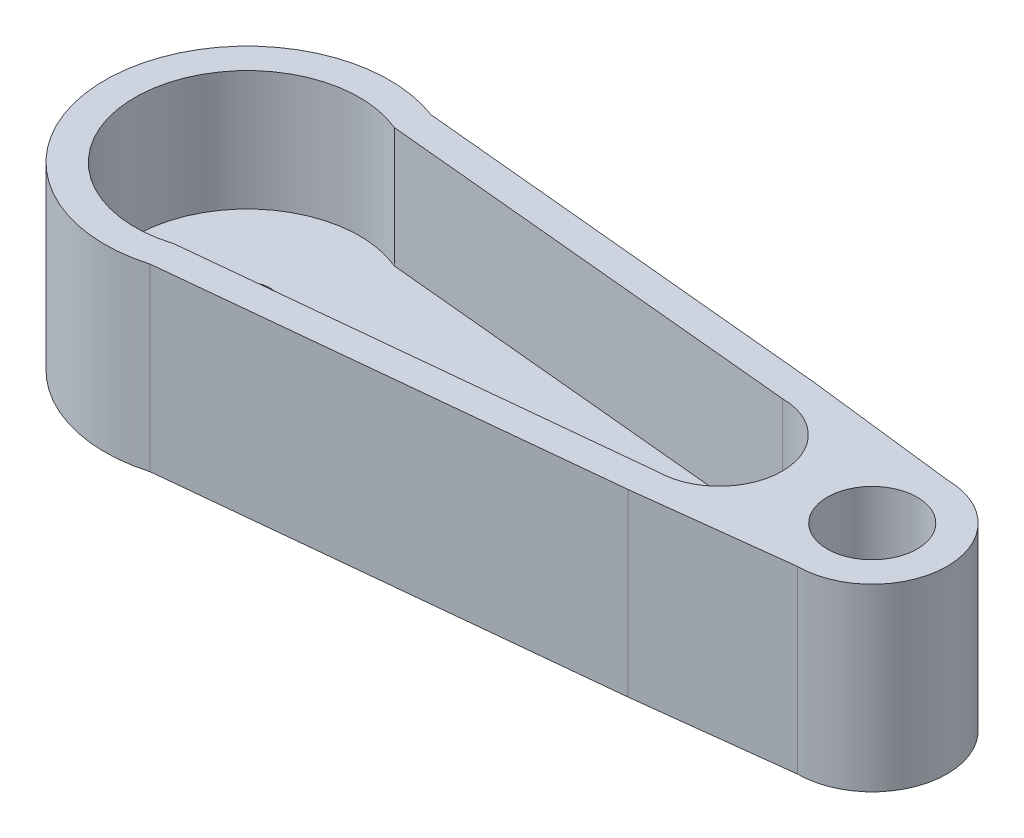
ISO-10303-21;
HEADER;
FILE_DESCRIPTION(('STEP AP214'),'2;1');
FILE_NAME('part.step','',(''),(''),'','','');
FILE_SCHEMA(('AUTOMOTIVE_DESIGN { 1 0 10303 214 1 1 1 1 }'));
ENDSEC;
DATA;
#1=APPLICATION_CONTEXT('core data for automotive mechanical design processes');
#2=APPLICATION_PROTOCOL_DEFINITION('international standard','automotive_design',2000,#1);
#3=PRODUCT_CONTEXT('',#1,'mechanical');
#4=PRODUCT('Part','Part','',(#3));
#5=PRODUCT_RELATED_PRODUCT_CATEGORY('part','',(#4));
#6=PRODUCT_DEFINITION_FORMATION('','',#4);
#7=PRODUCT_DEFINITION_CONTEXT('part definition',#1,'design');
#8=PRODUCT_DEFINITION('design','',#6,#7);
#9=PRODUCT_DEFINITION_SHAPE('','',#8);
#10=(LENGTH_UNIT() NAMED_UNIT(*) SI_UNIT(.MILLI.,.METRE.));
#11=(NAMED_UNIT(*) PLANE_ANGLE_UNIT() SI_UNIT($,.RADIAN.));
#12=(NAMED_UNIT(*) SI_UNIT($,.STERADIAN.) SOLID_ANGLE_UNIT());
#13=UNCERTAINTY_MEASURE_WITH_UNIT(LENGTH_MEASURE(1.E-05),#10,'distance_accuracy_value','');
#14=(GEOMETRIC_REPRESENTATION_CONTEXT(3) GLOBAL_UNCERTAINTY_ASSIGNED_CONTEXT((#13)) GLOBAL_UNIT_ASSIGNED_CONTEXT((#10,
#11,#12)) REPRESENTATION_CONTEXT('',''));
#15=CARTESIAN_POINT('',(0.,0.,0.));
#16=DIRECTION('',(0.,0.,1.));
#17=DIRECTION('',(1.,0.,0.));
#18=AXIS2_PLACEMENT_3D('',#15,#16,#17);
#19=CARTESIAN_POINT('',(0.,6.,0.));
#20=DIRECTION('',(0.,1.,0.));
#21=DIRECTION('',(0.,0.,1.));
#22=AXIS2_PLACEMENT_3D('',#19,#20,#21);
#23=PLANE('',#22);
#24=CARTESIAN_POINT('',(25.8499995720762,6.,-5.0016288422967));
#25=DIRECTION('',(0.,1.,0.));
#26=DIRECTION('',(0.,0.,1.));
#27=AXIS2_PLACEMENT_3D('',#24,#25,#26);
#28=CIRCLE('',#27,1.5);
#29=CARTESIAN_POINT('',(25.8499995720762,6.,-3.5016288422967));
#30=VERTEX_POINT('',#29);
#31=EDGE_CURVE('E145',#30,#30,#28,.T.);
#32=ORIENTED_EDGE('',*,*,#31,.F.);
#33=EDGE_LOOP('',(#32));
#34=FACE_BOUND('',#33,.T.);
#35=CARTESIAN_POINT('',(5.,6.,-5.));
#36=DIRECTION('',(0.,1.,0.));
#37=DIRECTION('',(0.,0.,1.));
#38=AXIS2_PLACEMENT_3D('',#35,#36,#37);
#39=CIRCLE('',#38,3.75);
#40=CARTESIAN_POINT('',(6.45010186973943,6.,-8.4582805796202));
#41=VERTEX_POINT('',#40);
#42=CARTESIAN_POINT('',(6.12769858731704,6.,-1.42357777993661));
#43=VERTEX_POINT('',#42);
#44=EDGE_CURVE('E178',#41,#43,#39,.T.);
#45=ORIENTED_EDGE('',*,*,#44,.F.);
#46=DIRECTION('',(0.995519190717505,0.,0.0945597214101386));
#47=VECTOR('',#46,1.);
#48=CARTESIAN_POINT('',(6.45010186973943,6.,-8.4582805796202));
#49=LINE('',#48,#47);
#50=CARTESIAN_POINT('',(20.75,6.,-7.1));
#51=VERTEX_POINT('',#50);
#52=EDGE_CURVE('E195',#41,#51,#49,.T.);
#53=ORIENTED_EDGE('',*,*,#52,.T.);
#54=CARTESIAN_POINT('',(20.75,6.,-5.));
#55=DIRECTION('',(0.,1.,0.));
#56=DIRECTION('',(0.,0.,1.));
#57=AXIS2_PLACEMENT_3D('',#54,#55,#56);
#58=CIRCLE('',#57,2.1);
#59=CARTESIAN_POINT('',(20.75,6.,-2.9));
#60=VERTEX_POINT('',#59);
#61=EDGE_CURVE('E212',#60,#51,#58,.T.);
#62=ORIENTED_EDGE('',*,*,#61,.F.);
#63=DIRECTION('',(0.994941120206471,0.,-0.100459779624941));
#64=VECTOR('',#63,1.);
#65=CARTESIAN_POINT('',(6.12769858731704,6.,-1.42357777993661));
#66=LINE('',#65,#64);
#67=EDGE_CURVE('E208',#43,#60,#66,.T.);
#68=ORIENTED_EDGE('',*,*,#67,.F.);
#69=EDGE_LOOP('',(#45,#53,#62,#68));
#70=FACE_BOUND('',#69,.T.);
#71=DIRECTION('',(-0.995519190717505,0.,-0.0945597214101386));
#72=VECTOR('',#71,1.);
#73=CARTESIAN_POINT('',(0.948462418420399,6.,-9.98535660988745));
#74=LINE('',#73,#72);
#75=CARTESIAN_POINT('',(20.8019731467672,6.,-8.09956429067298));
#76=VERTEX_POINT('',#75);
#77=CARTESIAN_POINT('',(6.68717667508372,6.,-9.44026292769397));
#78=VERTEX_POINT('',#77);
#79=EDGE_CURVE('E160',#76,#78,#74,.T.);
#80=ORIENTED_EDGE('',*,*,#79,.T.);
#81=CARTESIAN_POINT('',(5.,6.,-5.));
#82=DIRECTION('',(0.,1.,0.));
#83=DIRECTION('',(0.,0.,1.));
#84=AXIS2_PLACEMENT_3D('',#81,#82,#83);
#85=CIRCLE('',#84,4.75);
#86=CARTESIAN_POINT('',(6.32431463911399,6.,-0.438345614075047));
#87=VERTEX_POINT('',#86);
#88=EDGE_CURVE('E56',#78,#87,#85,.T.);
#89=ORIENTED_EDGE('',*,*,#88,.T.);
#90=DIRECTION('',(0.994941120206472,0.,-0.100459779624941));
#91=VECTOR('',#90,1.);
#92=CARTESIAN_POINT('',(0.0200127111028654,6.,0.198203393212601));
#93=LINE('',#92,#91);
#94=CARTESIAN_POINT('',(20.8052303443414,6.,-1.90049203758662));
#95=VERTEX_POINT('',#94);
#96=EDGE_CURVE('E138',#87,#95,#93,.T.);
#97=ORIENTED_EDGE('',*,*,#96,.T.);
#98=DIRECTION('',(-0.992975120394281,0.,0.118323329390122));
#99=VECTOR('',#98,1.);
#100=CARTESIAN_POINT('',(0.0679889179394782,6.,0.570566297655804));
#101=LINE('',#100,#99);
#102=CARTESIAN_POINT('',(25.8499995720763,6.,-2.5016288422967));
#103=VERTEX_POINT('',#102);
#104=EDGE_CURVE('E142',#103,#95,#101,.T.);
#105=ORIENTED_EDGE('',*,*,#104,.F.);
#106=CARTESIAN_POINT('',(25.8499995720762,6.,-5.0016288422967));
#107=DIRECTION('',(0.,1.,0.));
#108=DIRECTION('',(0.,0.,1.));
#109=AXIS2_PLACEMENT_3D('',#106,#107,#108);
#110=CIRCLE('',#109,2.5);
#111=CARTESIAN_POINT('',(25.8499995720762,6.,-7.5016288422967));
#112=VERTEX_POINT('',#111);
#113=EDGE_CURVE('E168',#103,#112,#110,.T.);
#114=ORIENTED_EDGE('',*,*,#113,.T.);
#115=DIRECTION('',(0.993057841099124,0.,0.117627055695305));
#116=VECTOR('',#115,1.);
#117=CARTESIAN_POINT('',(1.23393259617606,6.,-10.4173859727865));
#118=LINE('',#117,#116);
#119=EDGE_CURVE('E164',#76,#112,#118,.T.);
#120=ORIENTED_EDGE('',*,*,#119,.F.);
#121=EDGE_LOOP('',(#80,#89,#97,#105,#114,#120));
#122=FACE_BOUND('',#121,.T.);
#123=ADVANCED_FACE('F38',(#34,#70,#122),#23,.T.);
#124=CARTESIAN_POINT('',(5.,2.,-5.));
#125=DIRECTION('',(0.,1.,0.));
#126=DIRECTION('',(0.,0.,1.));
#127=AXIS2_PLACEMENT_3D('',#124,#125,#126);
#128=CYLINDRICAL_SURFACE('',#127,3.75);
#129=ORIENTED_EDGE('',*,*,#44,.T.);
#130=DIRECTION('',(0.,1.,0.));
#131=VECTOR('',#130,1.);
#132=CARTESIAN_POINT('',(6.12769858731704,2.,-1.42357777993661));
#133=LINE('',#132,#131);
#134=CARTESIAN_POINT('',(6.12769858731704,2.,-1.42357777993661));
#135=VERTEX_POINT('',#134);
#136=EDGE_CURVE('E42',#135,#43,#133,.T.);
#137=ORIENTED_EDGE('',*,*,#136,.F.);
#138=CARTESIAN_POINT('',(5.,2.,-5.));
#139=DIRECTION('',(0.,1.,0.));
#140=DIRECTION('',(0.,0.,1.));
#141=AXIS2_PLACEMENT_3D('',#138,#139,#140);
#142=CIRCLE('',#141,3.75);
#143=CARTESIAN_POINT('',(6.45010186973943,2.,-8.4582805796202));
#144=VERTEX_POINT('',#143);
#145=EDGE_CURVE('E190',#144,#135,#142,.T.);
#146=ORIENTED_EDGE('',*,*,#145,.F.);
#147=DIRECTION('',(0.,1.,0.));
#148=VECTOR('',#147,1.);
#149=CARTESIAN_POINT('',(6.45010186973943,2.,-8.4582805796202));
#150=LINE('',#149,#148);
#151=EDGE_CURVE('E11',#144,#41,#150,.T.);
#152=ORIENTED_EDGE('',*,*,#151,.T.);
#153=EDGE_LOOP('',(#129,#137,#146,#152));
#154=FACE_BOUND('',#153,.T.);
#155=ADVANCED_FACE('F243',(#154),#128,.F.);
#156=CARTESIAN_POINT('',(6.45010186973943,2.,-8.4582805796202));
#157=DIRECTION('',(-0.0945597214101386,0.,0.995519190717505));
#158=DIRECTION('',(0.995519190717506,0.,0.0945597214101386));
#159=AXIS2_PLACEMENT_3D('',#156,#157,#158);
#160=PLANE('',#159);
#161=ORIENTED_EDGE('',*,*,#52,.F.);
#162=ORIENTED_EDGE('',*,*,#151,.F.);
#163=DIRECTION('',(0.995519190717505,0.,0.0945597214101386));
#164=VECTOR('',#163,1.);
#165=CARTESIAN_POINT('',(6.45010186973943,2.,-8.4582805796202));
#166=LINE('',#165,#164);
#167=CARTESIAN_POINT('',(20.75,2.,-7.1));
#168=VERTEX_POINT('',#167);
#169=EDGE_CURVE('E203',#144,#168,#166,.T.);
#170=ORIENTED_EDGE('',*,*,#169,.T.);
#171=DIRECTION('',(0.,1.,0.));
#172=VECTOR('',#171,1.);
#173=CARTESIAN_POINT('',(20.75,2.,-7.1));
#174=LINE('',#173,#172);
#175=EDGE_CURVE('E48',#168,#51,#174,.T.);
#176=ORIENTED_EDGE('',*,*,#175,.T.);
#177=EDGE_LOOP('',(#161,#162,#170,#176));
#178=FACE_BOUND('',#177,.T.);
#179=ADVANCED_FACE('F244',(#178),#160,.T.);
#180=CARTESIAN_POINT('',(20.75,2.,-5.));
#181=DIRECTION('',(0.,1.,0.));
#182=DIRECTION('',(0.,0.,1.));
#183=AXIS2_PLACEMENT_3D('',#180,#181,#182);
#184=CYLINDRICAL_SURFACE('',#183,2.1);
#185=ORIENTED_EDGE('',*,*,#61,.T.);
#186=ORIENTED_EDGE('',*,*,#175,.F.);
#187=CARTESIAN_POINT('',(20.75,2.,-5.));
#188=DIRECTION('',(0.,1.,0.));
#189=DIRECTION('',(0.,0.,1.));
#190=AXIS2_PLACEMENT_3D('',#187,#188,#189);
#191=CIRCLE('',#190,2.1);
#192=CARTESIAN_POINT('',(20.75,2.,-2.9));
#193=VERTEX_POINT('',#192);
#194=EDGE_CURVE('E199',#193,#168,#191,.T.);
#195=ORIENTED_EDGE('',*,*,#194,.F.);
#196=DIRECTION('',(0.,1.,0.));
#197=VECTOR('',#196,1.);
#198=CARTESIAN_POINT('',(20.75,2.,-2.9));
#199=LINE('',#198,#197);
#200=EDGE_CURVE('E220',#193,#60,#199,.T.);
#201=ORIENTED_EDGE('',*,*,#200,.T.);
#202=EDGE_LOOP('',(#185,#186,#195,#201));
#203=FACE_BOUND('',#202,.T.);
#204=ADVANCED_FACE('F238',(#203),#184,.F.);
#205=CARTESIAN_POINT('',(6.12769858731704,2.,-1.42357777993661));
#206=DIRECTION('',(0.100459779624941,0.,0.994941120206471));
#207=DIRECTION('',(0.994941120206472,0.,-0.100459779624941));
#208=AXIS2_PLACEMENT_3D('',#205,#206,#207);
#209=PLANE('',#208);
#210=ORIENTED_EDGE('',*,*,#67,.T.);
#211=ORIENTED_EDGE('',*,*,#200,.F.);
#212=DIRECTION('',(0.994941120206471,0.,-0.100459779624941));
#213=VECTOR('',#212,1.);
#214=CARTESIAN_POINT('',(6.12769858731704,2.,-1.42357777993661));
#215=LINE('',#214,#213);
#216=EDGE_CURVE('E194',#135,#193,#215,.T.);
#217=ORIENTED_EDGE('',*,*,#216,.F.);
#218=ORIENTED_EDGE('',*,*,#136,.T.);
#219=EDGE_LOOP('',(#210,#211,#217,#218));
#220=FACE_BOUND('',#219,.T.);
#221=ADVANCED_FACE('F229',(#220),#209,.F.);
#222=CARTESIAN_POINT('',(5.,2.,-5.));
#223=DIRECTION('',(0.,1.,0.));
#224=DIRECTION('',(0.,0.,1.));
#225=AXIS2_PLACEMENT_3D('',#222,#223,#224);
#226=PLANE('',#225);
#227=CARTESIAN_POINT('',(5.,2.,-5.));
#228=DIRECTION('',(0.,1.,0.));
#229=DIRECTION('',(0.,0.,1.));
#230=AXIS2_PLACEMENT_3D('',#227,#228,#229);
#231=CIRCLE('',#230,0.75);
#232=CARTESIAN_POINT('',(5.,2.,-4.25));
#233=VERTEX_POINT('',#232);
#234=EDGE_CURVE('E305',#233,#233,#231,.T.);
#235=ORIENTED_EDGE('',*,*,#234,.F.);
#236=EDGE_LOOP('',(#235));
#237=FACE_BOUND('',#236,.T.);
#238=ORIENTED_EDGE('',*,*,#145,.T.);
#239=ORIENTED_EDGE('',*,*,#216,.T.);
#240=ORIENTED_EDGE('',*,*,#194,.T.);
#241=ORIENTED_EDGE('',*,*,#169,.F.);
#242=EDGE_LOOP('',(#238,#239,#240,#241));
#243=FACE_BOUND('',#242,.T.);
#244=ADVANCED_FACE('F242',(#237,#243),#226,.T.);
#245=CARTESIAN_POINT('',(5.,0.,-5.));
#246=DIRECTION('',(0.,1.,0.));
#247=DIRECTION('',(0.,0.,1.));
#248=AXIS2_PLACEMENT_3D('',#245,#246,#247);
#249=CYLINDRICAL_SURFACE('',#248,4.75);
#250=ORIENTED_EDGE('',*,*,#88,.F.);
#251=DIRECTION('',(0.,1.,0.));
#252=VECTOR('',#251,1.);
#253=CARTESIAN_POINT('',(6.68717667508372,0.,-9.44026292769397));
#254=LINE('',#253,#252);
#255=CARTESIAN_POINT('',(6.68717667508372,0.,-9.44026292769397));
#256=VERTEX_POINT('',#255);
#257=EDGE_CURVE('E122',#256,#78,#254,.T.);
#258=ORIENTED_EDGE('',*,*,#257,.F.);
#259=CARTESIAN_POINT('',(5.,0.,-5.));
#260=DIRECTION('',(0.,1.,0.));
#261=DIRECTION('',(0.,0.,1.));
#262=AXIS2_PLACEMENT_3D('',#259,#260,#261);
#263=CIRCLE('',#262,4.75);
#264=CARTESIAN_POINT('',(6.32431463911399,0.,-0.438345614075047));
#265=VERTEX_POINT('',#264);
#266=EDGE_CURVE('E128',#256,#265,#263,.T.);
#267=ORIENTED_EDGE('',*,*,#266,.T.);
#268=DIRECTION('',(0.,1.,0.));
#269=VECTOR('',#268,1.);
#270=CARTESIAN_POINT('',(6.32431463911399,0.,-0.438345614075047));
#271=LINE('',#270,#269);
#272=EDGE_CURVE('E175',#265,#87,#271,.T.);
#273=ORIENTED_EDGE('',*,*,#272,.T.);
#274=EDGE_LOOP('',(#250,#258,#267,#273));
#275=FACE_BOUND('',#274,.T.);
#276=ADVANCED_FACE('F130',(#275),#249,.T.);
#277=CARTESIAN_POINT('',(0.0200127111028654,0.,0.198203393212601));
#278=DIRECTION('',(0.100459779624941,0.,0.994941120206471));
#279=DIRECTION('',(0.994941120206472,0.,-0.100459779624941));
#280=AXIS2_PLACEMENT_3D('',#277,#278,#279);
#281=PLANE('',#280);
#282=ORIENTED_EDGE('',*,*,#96,.F.);
#283=ORIENTED_EDGE('',*,*,#272,.F.);
#284=DIRECTION('',(0.994941120206472,0.,-0.100459779624941));
#285=VECTOR('',#284,1.);
#286=CARTESIAN_POINT('',(0.0200127111028654,0.,0.198203393212601));
#287=LINE('',#286,#285);
#288=CARTESIAN_POINT('',(20.8052303443414,0.,-1.90049203758662));
#289=VERTEX_POINT('',#288);
#290=EDGE_CURVE('E133',#265,#289,#287,.T.);
#291=ORIENTED_EDGE('',*,*,#290,.T.);
#292=DIRECTION('',(0.,1.,0.));
#293=VECTOR('',#292,1.);
#294=CARTESIAN_POINT('',(20.8052303443414,0.,-1.90049203758662));
#295=LINE('',#294,#293);
#296=EDGE_CURVE('E179',#289,#95,#295,.T.);
#297=ORIENTED_EDGE('',*,*,#296,.T.);
#298=EDGE_LOOP('',(#282,#283,#291,#297));
#299=FACE_BOUND('',#298,.T.);
#300=ADVANCED_FACE('F271',(#299),#281,.T.);
#301=CARTESIAN_POINT('',(0.0679889179394782,0.,0.570566297655804));
#302=DIRECTION('',(-0.118323329390122,0.,-0.992975120394281));
#303=DIRECTION('',(-0.992975120394281,0.,0.118323329390122));
#304=AXIS2_PLACEMENT_3D('',#301,#302,#303);
#305=PLANE('',#304);
#306=ORIENTED_EDGE('',*,*,#104,.T.);
#307=ORIENTED_EDGE('',*,*,#296,.F.);
#308=DIRECTION('',(-0.992975120394281,0.,0.118323329390122));
#309=VECTOR('',#308,1.);
#310=CARTESIAN_POINT('',(0.0679889179394782,0.,0.570566297655804));
#311=LINE('',#310,#309);
#312=CARTESIAN_POINT('',(25.8499995720763,0.,-2.5016288422967));
#313=VERTEX_POINT('',#312);
#314=EDGE_CURVE('E153',#313,#289,#311,.T.);
#315=ORIENTED_EDGE('',*,*,#314,.F.);
#316=DIRECTION('',(0.,1.,0.));
#317=VECTOR('',#316,1.);
#318=CARTESIAN_POINT('',(25.8499995720763,0.,-2.5016288422967));
#319=LINE('',#318,#317);
#320=EDGE_CURVE('E182',#313,#103,#319,.T.);
#321=ORIENTED_EDGE('',*,*,#320,.T.);
#322=EDGE_LOOP('',(#306,#307,#315,#321));
#323=FACE_BOUND('',#322,.T.);
#324=ADVANCED_FACE('F283',(#323),#305,.F.);
#325=CARTESIAN_POINT('',(25.8499995720762,0.,-5.0016288422967));
#326=DIRECTION('',(0.,1.,0.));
#327=DIRECTION('',(0.,0.,1.));
#328=AXIS2_PLACEMENT_3D('',#325,#326,#327);
#329=CYLINDRICAL_SURFACE('',#328,2.5);
#330=ORIENTED_EDGE('',*,*,#113,.F.);
#331=ORIENTED_EDGE('',*,*,#320,.F.);
#332=CARTESIAN_POINT('',(25.8499995720762,0.,-5.0016288422967));
#333=DIRECTION('',(0.,1.,0.));
#334=DIRECTION('',(0.,0.,1.));
#335=AXIS2_PLACEMENT_3D('',#332,#333,#334);
#336=CIRCLE('',#335,2.5);
#337=CARTESIAN_POINT('',(25.8499995720762,0.,-7.5016288422967));
#338=VERTEX_POINT('',#337);
#339=EDGE_CURVE('E150',#313,#338,#336,.T.);
#340=ORIENTED_EDGE('',*,*,#339,.T.);
#341=DIRECTION('',(0.,1.,0.));
#342=VECTOR('',#341,1.);
#343=CARTESIAN_POINT('',(25.8499995720762,0.,-7.5016288422967));
#344=LINE('',#343,#342);
#345=EDGE_CURVE('E185',#338,#112,#344,.T.);
#346=ORIENTED_EDGE('',*,*,#345,.T.);
#347=EDGE_LOOP('',(#330,#331,#340,#346));
#348=FACE_BOUND('',#347,.T.);
#349=ADVANCED_FACE('F280',(#348),#329,.T.);
#350=CARTESIAN_POINT('',(1.23393259617606,0.,-10.4173859727865));
#351=DIRECTION('',(-0.117627055695305,0.,0.993057841099124));
#352=DIRECTION('',(0.993057841099125,0.,0.117627055695305));
#353=AXIS2_PLACEMENT_3D('',#350,#351,#352);
#354=PLANE('',#353);
#355=ORIENTED_EDGE('',*,*,#119,.T.);
#356=ORIENTED_EDGE('',*,*,#345,.F.);
#357=DIRECTION('',(0.993057841099124,0.,0.117627055695305));
#358=VECTOR('',#357,1.);
#359=CARTESIAN_POINT('',(1.23393259617606,0.,-10.4173859727865));
#360=LINE('',#359,#358);
#361=CARTESIAN_POINT('',(20.8019731467672,0.,-8.09956429067298));
#362=VERTEX_POINT('',#361);
#363=EDGE_CURVE('E64',#362,#338,#360,.T.);
#364=ORIENTED_EDGE('',*,*,#363,.F.);
#365=DIRECTION('',(0.,1.,0.));
#366=VECTOR('',#365,1.);
#367=CARTESIAN_POINT('',(20.8019731467672,0.,-8.09956429067298));
#368=LINE('',#367,#366);
#369=EDGE_CURVE('E124',#362,#76,#368,.T.);
#370=ORIENTED_EDGE('',*,*,#369,.T.);
#371=EDGE_LOOP('',(#355,#356,#364,#370));
#372=FACE_BOUND('',#371,.T.);
#373=ADVANCED_FACE('F277',(#372),#354,.F.);
#374=CARTESIAN_POINT('',(0.948462418420399,0.,-9.98535660988745));
#375=DIRECTION('',(0.0945597214101386,0.,-0.995519190717505));
#376=DIRECTION('',(-0.995519190717506,0.,-0.0945597214101386));
#377=AXIS2_PLACEMENT_3D('',#374,#375,#376);
#378=PLANE('',#377);
#379=ORIENTED_EDGE('',*,*,#79,.F.);
#380=ORIENTED_EDGE('',*,*,#369,.F.);
#381=DIRECTION('',(-0.995519190717505,0.,-0.0945597214101386));
#382=VECTOR('',#381,1.);
#383=CARTESIAN_POINT('',(0.948462418420399,0.,-9.98535660988745));
#384=LINE('',#383,#382);
#385=EDGE_CURVE('E119',#362,#256,#384,.T.);
#386=ORIENTED_EDGE('',*,*,#385,.T.);
#387=ORIENTED_EDGE('',*,*,#257,.T.);
#388=EDGE_LOOP('',(#379,#380,#386,#387));
#389=FACE_BOUND('',#388,.T.);
#390=ADVANCED_FACE('F121',(#389),#378,.T.);
#391=CARTESIAN_POINT('',(0.,0.,0.));
#392=DIRECTION('',(0.,1.,0.));
#393=DIRECTION('',(0.,0.,1.));
#394=AXIS2_PLACEMENT_3D('',#391,#392,#393);
#395=PLANE('',#394);
#396=CARTESIAN_POINT('',(5.,0.,-5.));
#397=DIRECTION('',(0.,1.,0.));
#398=DIRECTION('',(0.,0.,1.));
#399=AXIS2_PLACEMENT_3D('',#396,#397,#398);
#400=CIRCLE('',#399,0.75);
#401=CARTESIAN_POINT('',(5.,0.,-4.25));
#402=VERTEX_POINT('',#401);
#403=EDGE_CURVE('E303',#402,#402,#400,.T.);
#404=ORIENTED_EDGE('',*,*,#403,.T.);
#405=EDGE_LOOP('',(#404));
#406=FACE_BOUND('',#405,.T.);
#407=CARTESIAN_POINT('',(25.8499995720762,0.,-5.0016288422967));
#408=DIRECTION('',(0.,1.,0.));
#409=DIRECTION('',(0.,0.,1.));
#410=AXIS2_PLACEMENT_3D('',#407,#408,#409);
#411=CIRCLE('',#410,1.5);
#412=CARTESIAN_POINT('',(25.8499995720762,0.,-3.5016288422967));
#413=VERTEX_POINT('',#412);
#414=EDGE_CURVE('E161',#413,#413,#411,.T.);
#415=ORIENTED_EDGE('',*,*,#414,.T.);
#416=EDGE_LOOP('',(#415));
#417=FACE_BOUND('',#416,.T.);
#418=ORIENTED_EDGE('',*,*,#266,.F.);
#419=ORIENTED_EDGE('',*,*,#385,.F.);
#420=ORIENTED_EDGE('',*,*,#363,.T.);
#421=ORIENTED_EDGE('',*,*,#339,.F.);
#422=ORIENTED_EDGE('',*,*,#314,.T.);
#423=ORIENTED_EDGE('',*,*,#290,.F.);
#424=EDGE_LOOP('',(#418,#419,#420,#421,#422,#423));
#425=FACE_BOUND('',#424,.T.);
#426=ADVANCED_FACE('F40',(#406,#417,#425),#395,.F.);
#427=CARTESIAN_POINT('',(25.8499995720762,0.,-5.0016288422967));
#428=DIRECTION('',(0.,1.,0.));
#429=DIRECTION('',(0.,0.,1.));
#430=AXIS2_PLACEMENT_3D('',#427,#428,#429);
#431=CYLINDRICAL_SURFACE('',#430,1.5);
#432=ORIENTED_EDGE('',*,*,#414,.F.);
#433=EDGE_LOOP('',(#432));
#434=FACE_BOUND('',#433,.T.);
#435=ORIENTED_EDGE('',*,*,#31,.T.);
#436=EDGE_LOOP('',(#435));
#437=FACE_BOUND('',#436,.T.);
#438=ADVANCED_FACE('F291',(#434,#437),#431,.F.);
#439=CARTESIAN_POINT('',(5.,0.,-5.));
#440=DIRECTION('',(0.,1.,0.));
#441=DIRECTION('',(0.,0.,1.));
#442=AXIS2_PLACEMENT_3D('',#439,#440,#441);
#443=CYLINDRICAL_SURFACE('',#442,0.75);
#444=ORIENTED_EDGE('',*,*,#403,.F.);
#445=EDGE_LOOP('',(#444));
#446=FACE_BOUND('',#445,.T.);
#447=ORIENTED_EDGE('',*,*,#234,.T.);
#448=EDGE_LOOP('',(#447));
#449=FACE_BOUND('',#448,.T.);
#450=ADVANCED_FACE('F294',(#446,#449),#443,.F.);
#451=CLOSED_SHELL('',(#123,#155,#179,#204,#221,#244,#276,#300,#324,#349,#373,#390,#426,#438,#450));
#452=MANIFOLD_SOLID_BREP('B2',#451);
#453=ADVANCED_BREP_SHAPE_REPRESENTATION('',(#18,#452),#14);
#454=SHAPE_DEFINITION_REPRESENTATION(#9,#453);
ENDSEC;
END-ISO-10303-21;
